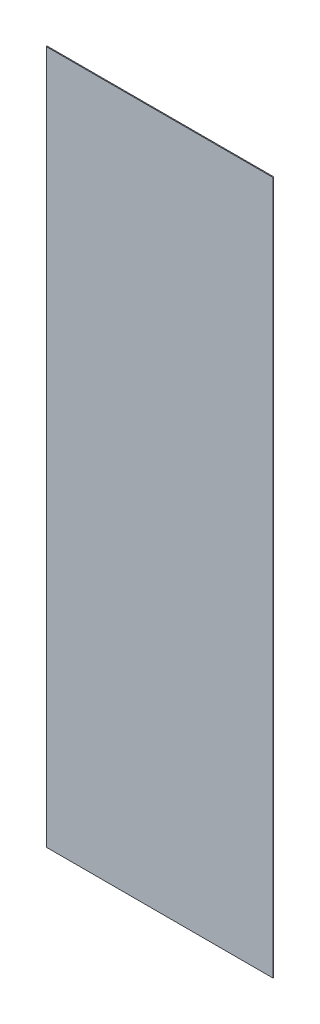
ISO-10303-21;
HEADER;
FILE_DESCRIPTION(('STEP AP214'),'2;1');
FILE_NAME('part.step','',(''),(''),'','','');
FILE_SCHEMA(('AUTOMOTIVE_DESIGN { 1 0 10303 214 1 1 1 1 }'));
ENDSEC;
DATA;
#1=APPLICATION_CONTEXT('core data for automotive mechanical design processes');
#2=APPLICATION_PROTOCOL_DEFINITION('international standard','automotive_design',2000,#1);
#3=PRODUCT_CONTEXT('',#1,'mechanical');
#4=PRODUCT('Part','Part','',(#3));
#5=PRODUCT_RELATED_PRODUCT_CATEGORY('part','',(#4));
#6=PRODUCT_DEFINITION_FORMATION('','',#4);
#7=PRODUCT_DEFINITION_CONTEXT('part definition',#1,'design');
#8=PRODUCT_DEFINITION('design','',#6,#7);
#9=PRODUCT_DEFINITION_SHAPE('','',#8);
#10=(LENGTH_UNIT() NAMED_UNIT(*) SI_UNIT(.MILLI.,.METRE.));
#11=(NAMED_UNIT(*) PLANE_ANGLE_UNIT() SI_UNIT($,.RADIAN.));
#12=(NAMED_UNIT(*) SI_UNIT($,.STERADIAN.) SOLID_ANGLE_UNIT());
#13=UNCERTAINTY_MEASURE_WITH_UNIT(LENGTH_MEASURE(1.E-05),#10,'distance_accuracy_value','');
#14=(GEOMETRIC_REPRESENTATION_CONTEXT(3) GLOBAL_UNCERTAINTY_ASSIGNED_CONTEXT((#13)) GLOBAL_UNIT_ASSIGNED_CONTEXT((#10,
#11,#12)) REPRESENTATION_CONTEXT('',''));
#15=CARTESIAN_POINT('',(0.,0.,0.));
#16=DIRECTION('',(0.,0.,1.));
#17=DIRECTION('',(1.,0.,0.));
#18=AXIS2_PLACEMENT_3D('',#15,#16,#17);
#19=CARTESIAN_POINT('',(4.30570902394106,-2.63338685018111,0.002));
#20=DIRECTION('',(0.,1.,0.));
#21=DIRECTION('',(0.,0.,1.));
#22=AXIS2_PLACEMENT_3D('',#19,#20,#21);
#23=PLANE('',#22);
#24=CARTESIAN_POINT('',(4.30570902394106,-2.63338685018111,0.));
#25=CARTESIAN_POINT('',(4.47022713321054,-2.63338685018111,0.));
#26=CARTESIAN_POINT('',(4.63474524248004,-2.63338685018111,0.));
#27=CARTESIAN_POINT('',(4.79926335174953,-2.63338685018111,0.));
#28=B_SPLINE_CURVE_WITH_KNOTS('',3,(#24,#25,#26,#27),.UNSPECIFIED.,.F.,.F.,(4,4),(0.,
0.123136846385116),.UNSPECIFIED.);
#29=CARTESIAN_POINT('',(4.30570902394106,-2.63338685018111,0.));
#30=VERTEX_POINT('',#29);
#31=CARTESIAN_POINT('',(4.79926335174953,-2.63338685018111,0.));
#32=VERTEX_POINT('',#31);
#33=EDGE_CURVE('E66',#30,#32,#28,.T.);
#34=ORIENTED_EDGE('',*,*,#33,.T.);
#35=DIRECTION('',(0.,0.,-1.));
#36=VECTOR('',#35,1.);
#37=CARTESIAN_POINT('',(4.79926335174953,-2.63338685018111,0.002));
#38=LINE('',#37,#36);
#39=CARTESIAN_POINT('',(4.79926335174953,-2.63338685018111,0.002));
#40=VERTEX_POINT('',#39);
#41=EDGE_CURVE('E74',#40,#32,#38,.T.);
#42=ORIENTED_EDGE('',*,*,#41,.F.);
#43=CARTESIAN_POINT('',(4.30570902394106,-2.63338685018111,0.002));
#44=CARTESIAN_POINT('',(4.47022713321054,-2.63338685018111,0.002));
#45=CARTESIAN_POINT('',(4.63474524248004,-2.63338685018111,0.002));
#46=CARTESIAN_POINT('',(4.79926335174953,-2.63338685018111,0.002));
#47=B_SPLINE_CURVE_WITH_KNOTS('',3,(#43,#44,#45,#46),.UNSPECIFIED.,.F.,.F.,(4,4),(0.,
0.123136846385116),.UNSPECIFIED.);
#48=CARTESIAN_POINT('',(4.30570902394106,-2.63338685018111,0.002));
#49=VERTEX_POINT('',#48);
#50=EDGE_CURVE('E79',#49,#40,#47,.T.);
#51=ORIENTED_EDGE('',*,*,#50,.F.);
#52=DIRECTION('',(0.,0.,-1.));
#53=VECTOR('',#52,1.);
#54=CARTESIAN_POINT('',(4.30570902394106,-2.63338685018111,0.002));
#55=LINE('',#54,#53);
#56=EDGE_CURVE('E71',#49,#30,#55,.T.);
#57=ORIENTED_EDGE('',*,*,#56,.T.);
#58=EDGE_LOOP('',(#34,#42,#51,#57));
#59=FACE_BOUND('',#58,.T.);
#60=ADVANCED_FACE('F17',(#59),#23,.F.);
#61=CARTESIAN_POINT('',(4.79926335174953,-2.63338685018111,0.002));
#62=DIRECTION('',(-1.,0.,0.));
#63=DIRECTION('',(0.,-1.,0.));
#64=AXIS2_PLACEMENT_3D('',#61,#62,#63);
#65=PLANE('',#64);
#66=CARTESIAN_POINT('',(4.79926335174953,-2.63338685018111,0.));
#67=CARTESIAN_POINT('',(4.79926335174953,-2.12987538869583,0.));
#68=CARTESIAN_POINT('',(4.79926335174953,-1.62636392721056,0.));
#69=CARTESIAN_POINT('',(4.79926335174953,-1.12285246572527,0.));
#70=B_SPLINE_CURVE_WITH_KNOTS('',3,(#66,#67,#68,#69),.UNSPECIFIED.,.F.,.F.,(4,4),
(0.123136846385116,0.5),.UNSPECIFIED.);
#71=CARTESIAN_POINT('',(4.79926335174953,-1.12285246572527,0.));
#72=VERTEX_POINT('',#71);
#73=EDGE_CURVE('E63',#32,#72,#70,.T.);
#74=ORIENTED_EDGE('',*,*,#73,.T.);
#75=DIRECTION('',(0.,0.,-1.));
#76=VECTOR('',#75,1.);
#77=CARTESIAN_POINT('',(4.79926335174953,-1.12285246572527,0.002));
#78=LINE('',#77,#76);
#79=CARTESIAN_POINT('',(4.79926335174953,-1.12285246572527,0.002));
#80=VERTEX_POINT('',#79);
#81=EDGE_CURVE('E70',#80,#72,#78,.T.);
#82=ORIENTED_EDGE('',*,*,#81,.F.);
#83=CARTESIAN_POINT('',(4.79926335174953,-2.63338685018111,0.002));
#84=CARTESIAN_POINT('',(4.79926335174953,-2.12987538869583,0.002));
#85=CARTESIAN_POINT('',(4.79926335174953,-1.62636392721056,0.002));
#86=CARTESIAN_POINT('',(4.79926335174953,-1.12285246572527,0.002));
#87=B_SPLINE_CURVE_WITH_KNOTS('',3,(#83,#84,#85,#86),.UNSPECIFIED.,.F.,.F.,(4,4),
(0.123136846385116,0.5),.UNSPECIFIED.);
#88=EDGE_CURVE('E57',#40,#80,#87,.T.);
#89=ORIENTED_EDGE('',*,*,#88,.F.);
#90=ORIENTED_EDGE('',*,*,#41,.T.);
#91=EDGE_LOOP('',(#74,#82,#89,#90));
#92=FACE_BOUND('',#91,.T.);
#93=ADVANCED_FACE('F75',(#92),#65,.F.);
#94=CARTESIAN_POINT('',(4.79926335174953,-1.12285246572527,0.002));
#95=DIRECTION('',(0.,-1.,0.));
#96=DIRECTION('',(0.,0.,-1.));
#97=AXIS2_PLACEMENT_3D('',#94,#95,#96);
#98=PLANE('',#97);
#99=CARTESIAN_POINT('',(4.79926335174953,-1.12285246572527,0.));
#100=CARTESIAN_POINT('',(4.63474524248004,-1.12285246572527,0.));
#101=CARTESIAN_POINT('',(4.47022713321055,-1.12285246572527,0.));
#102=CARTESIAN_POINT('',(4.30570902394106,-1.12285246572527,0.));
#103=B_SPLINE_CURVE_WITH_KNOTS('',3,(#99,#100,#101,#102),.UNSPECIFIED.,.F.,.F.,(4,4),(0.5,
0.623136846385117),.UNSPECIFIED.);
#104=CARTESIAN_POINT('',(4.30570902394106,-1.12285246572527,0.));
#105=VERTEX_POINT('',#104);
#106=EDGE_CURVE('E67',#72,#105,#103,.T.);
#107=ORIENTED_EDGE('',*,*,#106,.T.);
#108=DIRECTION('',(0.,0.,-1.));
#109=VECTOR('',#108,1.);
#110=CARTESIAN_POINT('',(4.30570902394106,-1.12285246572527,0.002));
#111=LINE('',#110,#109);
#112=CARTESIAN_POINT('',(4.30570902394106,-1.12285246572527,0.002));
#113=VERTEX_POINT('',#112);
#114=EDGE_CURVE('E126',#113,#105,#111,.T.);
#115=ORIENTED_EDGE('',*,*,#114,.F.);
#116=CARTESIAN_POINT('',(4.79926335174953,-1.12285246572527,0.002));
#117=CARTESIAN_POINT('',(4.63474524248004,-1.12285246572527,0.002));
#118=CARTESIAN_POINT('',(4.47022713321055,-1.12285246572527,0.002));
#119=CARTESIAN_POINT('',(4.30570902394106,-1.12285246572527,0.002));
#120=B_SPLINE_CURVE_WITH_KNOTS('',3,(#116,#117,#118,#119),.UNSPECIFIED.,.F.,.F.,(4,4),(0.5,
0.623136846385117),.UNSPECIFIED.);
#121=EDGE_CURVE('E38',#80,#113,#120,.T.);
#122=ORIENTED_EDGE('',*,*,#121,.F.);
#123=ORIENTED_EDGE('',*,*,#81,.T.);
#124=EDGE_LOOP('',(#107,#115,#122,#123));
#125=FACE_BOUND('',#124,.T.);
#126=ADVANCED_FACE('F160',(#125),#98,.F.);
#127=CARTESIAN_POINT('',(4.30570902394106,-1.12285246572527,0.002));
#128=DIRECTION('',(1.,0.,0.));
#129=DIRECTION('',(0.,1.,0.));
#130=AXIS2_PLACEMENT_3D('',#127,#128,#129);
#131=PLANE('',#130);
#132=CARTESIAN_POINT('',(4.30570902394106,-1.12285246572527,0.));
#133=CARTESIAN_POINT('',(4.30570902394106,-1.62636392721056,0.));
#134=CARTESIAN_POINT('',(4.30570902394106,-2.12987538869583,0.));
#135=CARTESIAN_POINT('',(4.30570902394106,-2.63338685018111,0.));
#136=B_SPLINE_CURVE_WITH_KNOTS('',3,(#132,#133,#134,#135),.UNSPECIFIED.,.F.,.F.,(4,4),
(0.623136846385117,1.),.UNSPECIFIED.);
#137=EDGE_CURVE('E30',#105,#30,#136,.T.);
#138=ORIENTED_EDGE('',*,*,#137,.T.);
#139=ORIENTED_EDGE('',*,*,#56,.F.);
#140=CARTESIAN_POINT('',(4.30570902394106,-1.12285246572527,0.002));
#141=CARTESIAN_POINT('',(4.30570902394106,-1.62636392721056,0.002));
#142=CARTESIAN_POINT('',(4.30570902394106,-2.12987538869583,0.002));
#143=CARTESIAN_POINT('',(4.30570902394106,-2.63338685018111,0.002));
#144=B_SPLINE_CURVE_WITH_KNOTS('',3,(#140,#141,#142,#143),.UNSPECIFIED.,.F.,.F.,(4,4),
(0.623136846385117,1.),.UNSPECIFIED.);
#145=EDGE_CURVE('E11',#113,#49,#144,.T.);
#146=ORIENTED_EDGE('',*,*,#145,.F.);
#147=ORIENTED_EDGE('',*,*,#114,.T.);
#148=EDGE_LOOP('',(#138,#139,#146,#147));
#149=FACE_BOUND('',#148,.T.);
#150=ADVANCED_FACE('F157',(#149),#131,.F.);
#151=CARTESIAN_POINT('',(4.55248618784529,-2.63338685018111,0.002));
#152=DIRECTION('',(0.,0.,-1.));
#153=DIRECTION('',(-1.,0.,0.));
#154=AXIS2_PLACEMENT_3D('',#151,#152,#153);
#155=PLANE('',#154);
#156=ORIENTED_EDGE('',*,*,#50,.T.);
#157=ORIENTED_EDGE('',*,*,#88,.T.);
#158=ORIENTED_EDGE('',*,*,#121,.T.);
#159=ORIENTED_EDGE('',*,*,#145,.T.);
#160=EDGE_LOOP('',(#156,#157,#158,#159));
#161=FACE_BOUND('',#160,.T.);
#162=ADVANCED_FACE('F168',(#161),#155,.F.);
#163=CARTESIAN_POINT('',(4.55248618784529,-2.63338685018111,0.));
#164=DIRECTION('',(0.,0.,-1.));
#165=DIRECTION('',(-1.,0.,0.));
#166=AXIS2_PLACEMENT_3D('',#163,#164,#165);
#167=PLANE('',#166);
#168=ORIENTED_EDGE('',*,*,#33,.F.);
#169=ORIENTED_EDGE('',*,*,#137,.F.);
#170=ORIENTED_EDGE('',*,*,#106,.F.);
#171=ORIENTED_EDGE('',*,*,#73,.F.);
#172=EDGE_LOOP('',(#168,#169,#170,#171));
#173=FACE_BOUND('',#172,.T.);
#174=ADVANCED_FACE('F19',(#173),#167,.T.);
#175=CLOSED_SHELL('',(#60,#93,#126,#150,#162,#174));
#176=MANIFOLD_SOLID_BREP('B1',#175);
#177=ADVANCED_BREP_SHAPE_REPRESENTATION('',(#18,#176),#14);
#178=SHAPE_DEFINITION_REPRESENTATION(#9,#177);
ENDSEC;
END-ISO-10303-21;
